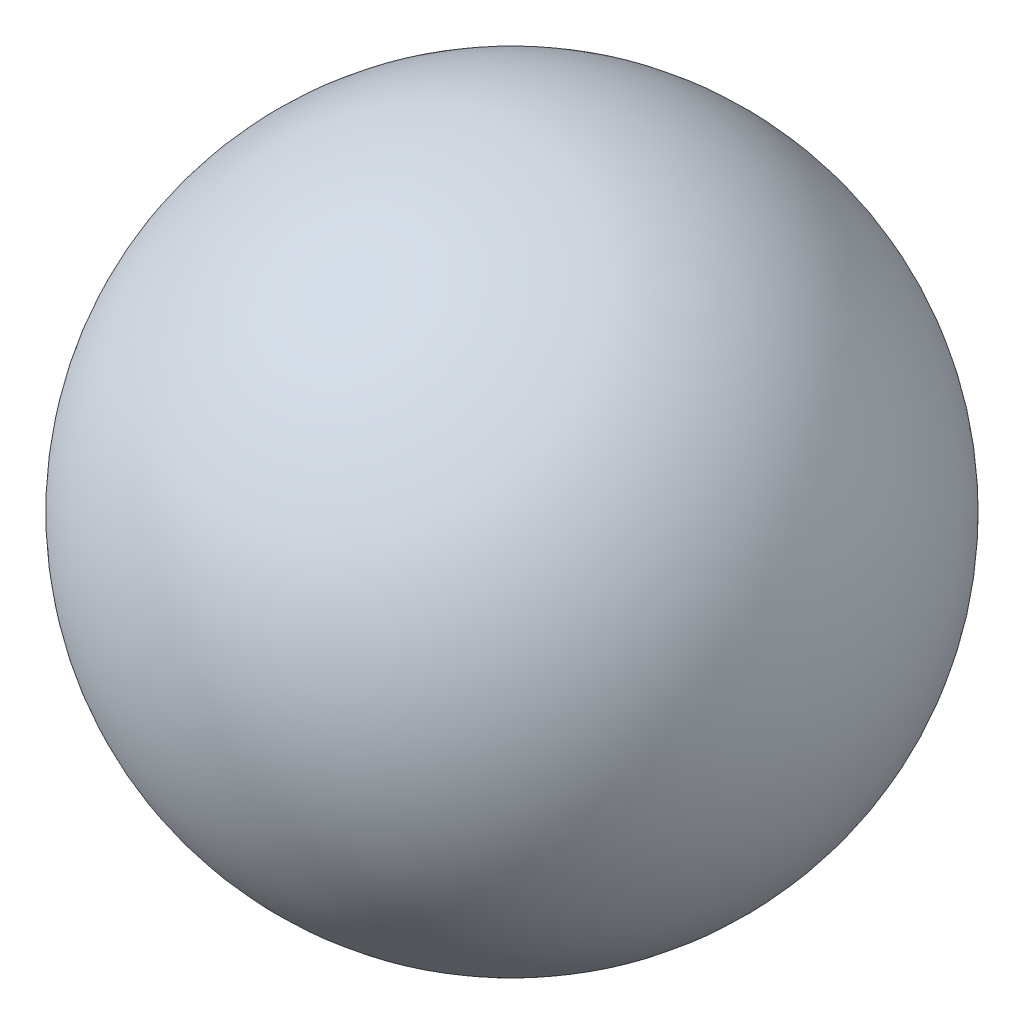
ISO-10303-21;
HEADER;
FILE_DESCRIPTION(('STEP AP214'),'2;1');
FILE_NAME('part.step','',(''),(''),'','','');
FILE_SCHEMA(('AUTOMOTIVE_DESIGN { 1 0 10303 214 1 1 1 1 }'));
ENDSEC;
DATA;
#1=APPLICATION_CONTEXT('core data for automotive mechanical design processes');
#2=APPLICATION_PROTOCOL_DEFINITION('international standard','automotive_design',2000,#1);
#3=PRODUCT_CONTEXT('',#1,'mechanical');
#4=PRODUCT('Part','Part','',(#3));
#5=PRODUCT_RELATED_PRODUCT_CATEGORY('part','',(#4));
#6=PRODUCT_DEFINITION_FORMATION('','',#4);
#7=PRODUCT_DEFINITION_CONTEXT('part definition',#1,'design');
#8=PRODUCT_DEFINITION('design','',#6,#7);
#9=PRODUCT_DEFINITION_SHAPE('','',#8);
#10=(LENGTH_UNIT() NAMED_UNIT(*) SI_UNIT(.MILLI.,.METRE.));
#11=(NAMED_UNIT(*) PLANE_ANGLE_UNIT() SI_UNIT($,.RADIAN.));
#12=(NAMED_UNIT(*) SI_UNIT($,.STERADIAN.) SOLID_ANGLE_UNIT());
#13=UNCERTAINTY_MEASURE_WITH_UNIT(LENGTH_MEASURE(1.E-05),#10,'distance_accuracy_value','');
#14=(GEOMETRIC_REPRESENTATION_CONTEXT(3) GLOBAL_UNCERTAINTY_ASSIGNED_CONTEXT((#13)) GLOBAL_UNIT_ASSIGNED_CONTEXT((#10,
#11,#12)) REPRESENTATION_CONTEXT('',''));
#15=CARTESIAN_POINT('',(0.,0.,0.));
#16=DIRECTION('',(0.,0.,1.));
#17=DIRECTION('',(1.,0.,0.));
#18=AXIS2_PLACEMENT_3D('',#15,#16,#17);
#19=CARTESIAN_POINT('',(0.,0.,0.));
#20=DIRECTION('',(0.,1.,0.));
#21=DIRECTION('',(0.,0.,-1.));
#22=AXIS2_PLACEMENT_3D('',#19,#20,#21);
#23=SPHERICAL_SURFACE('',#22,50.8);
#24=CARTESIAN_POINT('',(0.,50.8,0.));
#25=VERTEX_POINT('',#24);
#26=VERTEX_LOOP('',#25);
#27=FACE_BOUND('',#26,.T.);
#28=ADVANCED_FACE('F29',(#27),#23,.T.);
#29=CLOSED_SHELL('',(#28));
#30=MANIFOLD_SOLID_BREP('B2',#29);
#31=ADVANCED_BREP_SHAPE_REPRESENTATION('',(#18,#30),#14);
#32=SHAPE_DEFINITION_REPRESENTATION(#9,#31);
ENDSEC;
END-ISO-10303-21;
